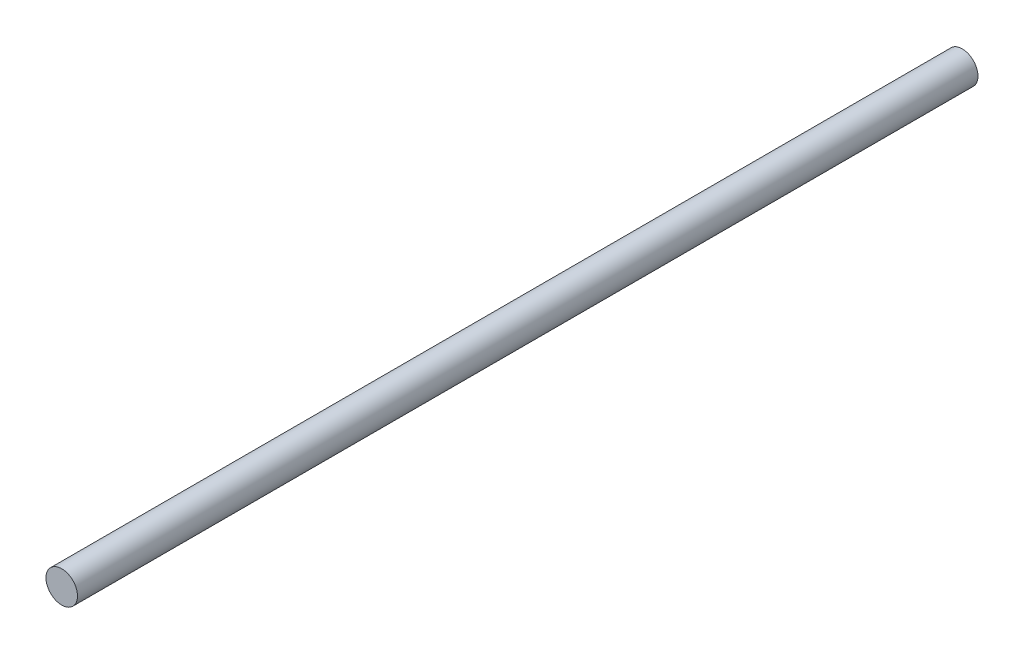
ISO-10303-21;
HEADER;
FILE_DESCRIPTION(('STEP AP214'),'2;1');
FILE_NAME('part.step','',(''),(''),'','','');
FILE_SCHEMA(('AUTOMOTIVE_DESIGN { 1 0 10303 214 1 1 1 1 }'));
ENDSEC;
DATA;
#1=APPLICATION_CONTEXT('core data for automotive mechanical design processes');
#2=APPLICATION_PROTOCOL_DEFINITION('international standard','automotive_design',2000,#1);
#3=PRODUCT_CONTEXT('',#1,'mechanical');
#4=PRODUCT('Part','Part','',(#3));
#5=PRODUCT_RELATED_PRODUCT_CATEGORY('part','',(#4));
#6=PRODUCT_DEFINITION_FORMATION('','',#4);
#7=PRODUCT_DEFINITION_CONTEXT('part definition',#1,'design');
#8=PRODUCT_DEFINITION('design','',#6,#7);
#9=PRODUCT_DEFINITION_SHAPE('','',#8);
#10=(LENGTH_UNIT() NAMED_UNIT(*) SI_UNIT(.MILLI.,.METRE.));
#11=(NAMED_UNIT(*) PLANE_ANGLE_UNIT() SI_UNIT($,.RADIAN.));
#12=(NAMED_UNIT(*) SI_UNIT($,.STERADIAN.) SOLID_ANGLE_UNIT());
#13=UNCERTAINTY_MEASURE_WITH_UNIT(LENGTH_MEASURE(1.E-05),#10,'distance_accuracy_value','');
#14=(GEOMETRIC_REPRESENTATION_CONTEXT(3) GLOBAL_UNCERTAINTY_ASSIGNED_CONTEXT((#13)) GLOBAL_UNIT_ASSIGNED_CONTEXT((#10,
#11,#12)) REPRESENTATION_CONTEXT('',''));
#15=CARTESIAN_POINT('',(0.,0.,0.));
#16=DIRECTION('',(0.,0.,1.));
#17=DIRECTION('',(1.,0.,0.));
#18=AXIS2_PLACEMENT_3D('',#15,#16,#17);
#19=CARTESIAN_POINT('',(0.,0.,228.5));
#20=DIRECTION('',(0.,0.,-1.));
#21=DIRECTION('',(-1.,0.,0.));
#22=AXIS2_PLACEMENT_3D('',#19,#20,#21);
#23=CYLINDRICAL_SURFACE('',#22,4.);
#24=CARTESIAN_POINT('',(0.,0.,228.5));
#25=DIRECTION('',(0.,0.,1.));
#26=DIRECTION('',(1.,0.,0.));
#27=AXIS2_PLACEMENT_3D('',#24,#25,#26);
#28=CIRCLE('',#27,4.);
#29=CARTESIAN_POINT('',(4.,0.,228.5));
#30=VERTEX_POINT('',#29);
#31=EDGE_CURVE('E10',#30,#30,#28,.T.);
#32=ORIENTED_EDGE('',*,*,#31,.F.);
#33=EDGE_LOOP('',(#32));
#34=FACE_BOUND('',#33,.T.);
#35=CARTESIAN_POINT('',(0.,0.,0.));
#36=DIRECTION('',(0.,0.,1.));
#37=DIRECTION('',(1.,0.,0.));
#38=AXIS2_PLACEMENT_3D('',#35,#36,#37);
#39=CIRCLE('',#38,4.);
#40=CARTESIAN_POINT('',(4.,0.,0.));
#41=VERTEX_POINT('',#40);
#42=EDGE_CURVE('E40',#41,#41,#39,.T.);
#43=ORIENTED_EDGE('',*,*,#42,.T.);
#44=EDGE_LOOP('',(#43));
#45=FACE_BOUND('',#44,.T.);
#46=ADVANCED_FACE('F37',(#34,#45),#23,.T.);
#47=CARTESIAN_POINT('',(0.,0.,228.5));
#48=DIRECTION('',(0.,0.,1.));
#49=DIRECTION('',(1.,0.,0.));
#50=AXIS2_PLACEMENT_3D('',#47,#48,#49);
#51=PLANE('',#50);
#52=ORIENTED_EDGE('',*,*,#31,.T.);
#53=EDGE_LOOP('',(#52));
#54=FACE_BOUND('',#53,.T.);
#55=ADVANCED_FACE('F52',(#54),#51,.T.);
#56=CARTESIAN_POINT('',(0.,0.,0.));
#57=DIRECTION('',(0.,0.,1.));
#58=DIRECTION('',(1.,0.,0.));
#59=AXIS2_PLACEMENT_3D('',#56,#57,#58);
#60=PLANE('',#59);
#61=ORIENTED_EDGE('',*,*,#42,.F.);
#62=EDGE_LOOP('',(#61));
#63=FACE_BOUND('',#62,.T.);
#64=ADVANCED_FACE('F50',(#63),#60,.F.);
#65=CLOSED_SHELL('',(#46,#55,#64));
#66=MANIFOLD_SOLID_BREP('B2',#65);
#67=ADVANCED_BREP_SHAPE_REPRESENTATION('',(#18,#66),#14);
#68=SHAPE_DEFINITION_REPRESENTATION(#9,#67);
ENDSEC;
END-ISO-10303-21;
